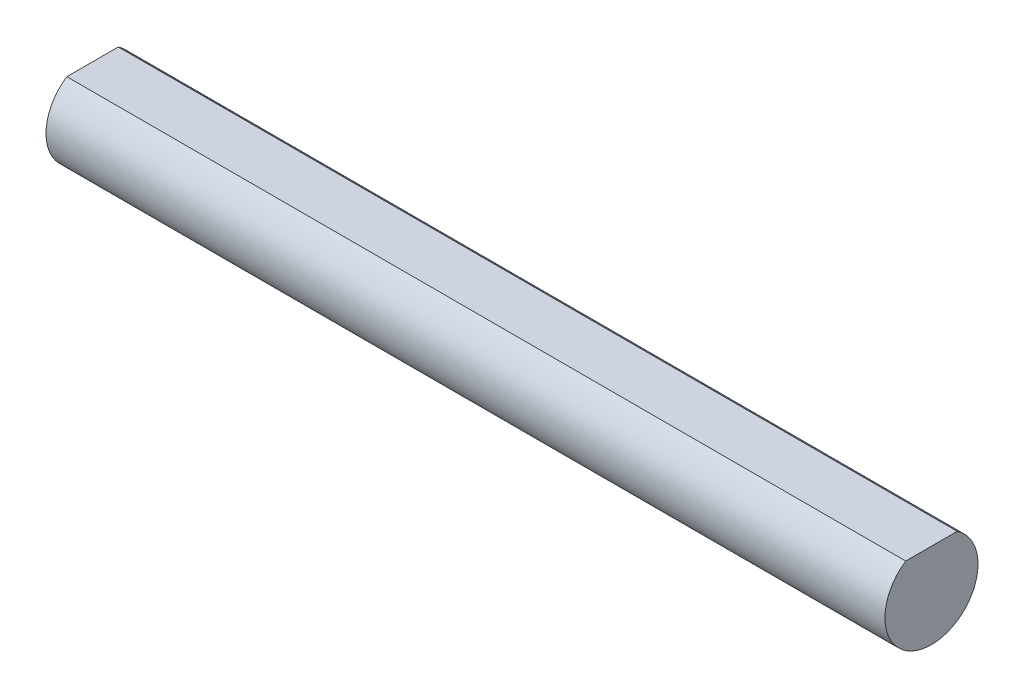
ISO-10303-21;
HEADER;
FILE_DESCRIPTION(('STEP AP214'),'2;1');
FILE_NAME('part.step','',(''),(''),'','','');
FILE_SCHEMA(('AUTOMOTIVE_DESIGN { 1 0 10303 214 1 1 1 1 }'));
ENDSEC;
DATA;
#1=APPLICATION_CONTEXT('core data for automotive mechanical design processes');
#2=APPLICATION_PROTOCOL_DEFINITION('international standard','automotive_design',2000,#1);
#3=PRODUCT_CONTEXT('',#1,'mechanical');
#4=PRODUCT('Part','Part','',(#3));
#5=PRODUCT_RELATED_PRODUCT_CATEGORY('part','',(#4));
#6=PRODUCT_DEFINITION_FORMATION('','',#4);
#7=PRODUCT_DEFINITION_CONTEXT('part definition',#1,'design');
#8=PRODUCT_DEFINITION('design','',#6,#7);
#9=PRODUCT_DEFINITION_SHAPE('','',#8);
#10=(LENGTH_UNIT() NAMED_UNIT(*) SI_UNIT(.MILLI.,.METRE.));
#11=(NAMED_UNIT(*) PLANE_ANGLE_UNIT() SI_UNIT($,.RADIAN.));
#12=(NAMED_UNIT(*) SI_UNIT($,.STERADIAN.) SOLID_ANGLE_UNIT());
#13=UNCERTAINTY_MEASURE_WITH_UNIT(LENGTH_MEASURE(1.E-05),#10,'distance_accuracy_value','');
#14=(GEOMETRIC_REPRESENTATION_CONTEXT(3) GLOBAL_UNCERTAINTY_ASSIGNED_CONTEXT((#13)) GLOBAL_UNIT_ASSIGNED_CONTEXT((#10,
#11,#12)) REPRESENTATION_CONTEXT('',''));
#15=CARTESIAN_POINT('',(0.,0.,0.));
#16=DIRECTION('',(0.,0.,1.));
#17=DIRECTION('',(1.,0.,0.));
#18=AXIS2_PLACEMENT_3D('',#15,#16,#17);
#19=CARTESIAN_POINT('',(92.175,0.,0.));
#20=DIRECTION('',(-1.,0.,0.));
#21=DIRECTION('',(0.,0.,1.));
#22=AXIS2_PLACEMENT_3D('',#19,#20,#21);
#23=CYLINDRICAL_SURFACE('',#22,3.);
#24=CARTESIAN_POINT('',(38.1000000000001,0.,0.));
#25=DIRECTION('',(1.,0.,0.));
#26=DIRECTION('',(0.,0.,-1.));
#27=AXIS2_PLACEMENT_3D('',#24,#25,#26);
#28=CIRCLE('',#27,3.);
#29=CARTESIAN_POINT('',(38.1000000000001,2.5,1.6583123951777));
#30=VERTEX_POINT('',#29);
#31=CARTESIAN_POINT('',(38.1000000000001,2.5,-1.6583123951777));
#32=VERTEX_POINT('',#31);
#33=EDGE_CURVE('E76',#30,#32,#28,.T.);
#34=ORIENTED_EDGE('',*,*,#33,.T.);
#35=DIRECTION('',(-1.,0.,0.));
#36=VECTOR('',#35,1.);
#37=CARTESIAN_POINT('',(92.175,2.5,-1.6583123951777));
#38=LINE('',#37,#36);
#39=CARTESIAN_POINT('',(92.175,2.5,-1.6583123951777));
#40=VERTEX_POINT('',#39);
#41=EDGE_CURVE('E11',#40,#32,#38,.T.);
#42=ORIENTED_EDGE('',*,*,#41,.F.);
#43=CARTESIAN_POINT('',(92.175,0.,0.));
#44=DIRECTION('',(1.,0.,0.));
#45=DIRECTION('',(0.,0.,-1.));
#46=AXIS2_PLACEMENT_3D('',#43,#44,#45);
#47=CIRCLE('',#46,3.);
#48=CARTESIAN_POINT('',(92.175,2.5,1.6583123951777));
#49=VERTEX_POINT('',#48);
#50=EDGE_CURVE('E75',#49,#40,#47,.T.);
#51=ORIENTED_EDGE('',*,*,#50,.F.);
#52=DIRECTION('',(-1.,0.,0.));
#53=VECTOR('',#52,1.);
#54=CARTESIAN_POINT('',(92.175,2.5,1.6583123951777));
#55=LINE('',#54,#53);
#56=EDGE_CURVE('E53',#49,#30,#55,.T.);
#57=ORIENTED_EDGE('',*,*,#56,.T.);
#58=EDGE_LOOP('',(#34,#42,#51,#57));
#59=FACE_BOUND('',#58,.T.);
#60=ADVANCED_FACE('F45',(#59),#23,.T.);
#61=CARTESIAN_POINT('',(92.175,2.5,1.6583123951777));
#62=DIRECTION('',(0.,-1.,0.));
#63=DIRECTION('',(0.,0.,-1.));
#64=AXIS2_PLACEMENT_3D('',#61,#62,#63);
#65=PLANE('',#64);
#66=DIRECTION('',(0.,0.,1.));
#67=VECTOR('',#66,1.);
#68=CARTESIAN_POINT('',(38.1000000000001,2.5,1.6583123951777));
#69=LINE('',#68,#67);
#70=EDGE_CURVE('E68',#32,#30,#69,.T.);
#71=ORIENTED_EDGE('',*,*,#70,.T.);
#72=ORIENTED_EDGE('',*,*,#56,.F.);
#73=DIRECTION('',(0.,0.,1.));
#74=VECTOR('',#73,1.);
#75=CARTESIAN_POINT('',(92.175,2.5,1.6583123951777));
#76=LINE('',#75,#74);
#77=EDGE_CURVE('E60',#40,#49,#76,.T.);
#78=ORIENTED_EDGE('',*,*,#77,.F.);
#79=ORIENTED_EDGE('',*,*,#41,.T.);
#80=EDGE_LOOP('',(#71,#72,#78,#79));
#81=FACE_BOUND('',#80,.T.);
#82=ADVANCED_FACE('F71',(#81),#65,.F.);
#83=CARTESIAN_POINT('',(92.175,0.,0.));
#84=DIRECTION('',(1.,0.,0.));
#85=DIRECTION('',(0.,0.,-1.));
#86=AXIS2_PLACEMENT_3D('',#83,#84,#85);
#87=PLANE('',#86);
#88=ORIENTED_EDGE('',*,*,#50,.T.);
#89=ORIENTED_EDGE('',*,*,#77,.T.);
#90=EDGE_LOOP('',(#88,#89));
#91=FACE_BOUND('',#90,.T.);
#92=ADVANCED_FACE('F83',(#91),#87,.T.);
#93=CARTESIAN_POINT('',(38.1000000000001,0.,0.));
#94=DIRECTION('',(1.,0.,0.));
#95=DIRECTION('',(0.,0.,-1.));
#96=AXIS2_PLACEMENT_3D('',#93,#94,#95);
#97=PLANE('',#96);
#98=ORIENTED_EDGE('',*,*,#33,.F.);
#99=ORIENTED_EDGE('',*,*,#70,.F.);
#100=EDGE_LOOP('',(#98,#99));
#101=FACE_BOUND('',#100,.T.);
#102=ADVANCED_FACE('F79',(#101),#97,.F.);
#103=CLOSED_SHELL('',(#60,#82,#92,#102));
#104=MANIFOLD_SOLID_BREP('B2',#103);
#105=ADVANCED_BREP_SHAPE_REPRESENTATION('',(#18,#104),#14);
#106=SHAPE_DEFINITION_REPRESENTATION(#9,#105);
ENDSEC;
END-ISO-10303-21;
